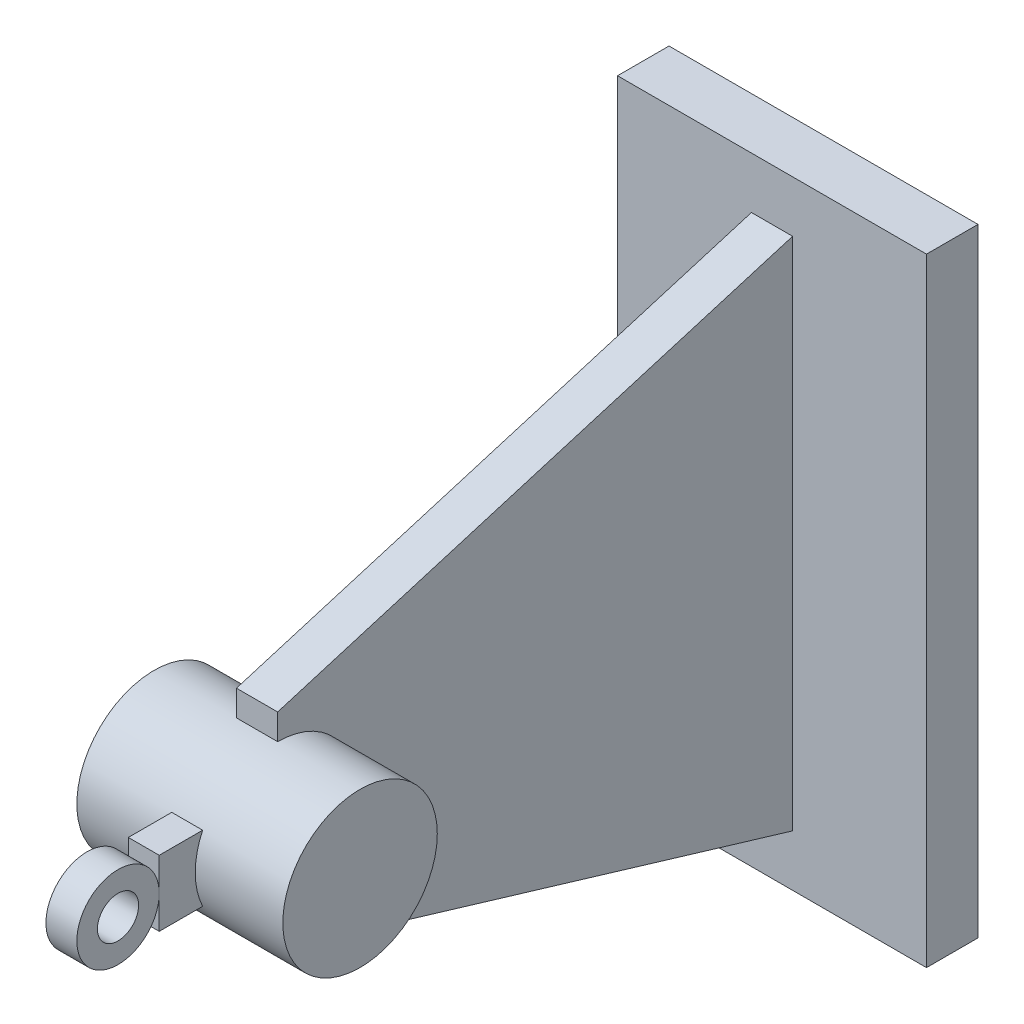
ISO-10303-21;
HEADER;
FILE_DESCRIPTION(('STEP AP214'),'2;1');
FILE_NAME('part.step','',(''),(''),'','','');
FILE_SCHEMA(('AUTOMOTIVE_DESIGN { 1 0 10303 214 1 1 1 1 }'));
ENDSEC;
DATA;
#1=APPLICATION_CONTEXT('core data for automotive mechanical design processes');
#2=APPLICATION_PROTOCOL_DEFINITION('international standard','automotive_design',2000,#1);
#3=PRODUCT_CONTEXT('',#1,'mechanical');
#4=PRODUCT('Part','Part','',(#3));
#5=PRODUCT_RELATED_PRODUCT_CATEGORY('part','',(#4));
#6=PRODUCT_DEFINITION_FORMATION('','',#4);
#7=PRODUCT_DEFINITION_CONTEXT('part definition',#1,'design');
#8=PRODUCT_DEFINITION('design','',#6,#7);
#9=PRODUCT_DEFINITION_SHAPE('','',#8);
#10=(LENGTH_UNIT() NAMED_UNIT(*) SI_UNIT(.MILLI.,.METRE.));
#11=(NAMED_UNIT(*) PLANE_ANGLE_UNIT() SI_UNIT($,.RADIAN.));
#12=(NAMED_UNIT(*) SI_UNIT($,.STERADIAN.) SOLID_ANGLE_UNIT());
#13=UNCERTAINTY_MEASURE_WITH_UNIT(LENGTH_MEASURE(1.E-05),#10,'distance_accuracy_value','');
#14=(GEOMETRIC_REPRESENTATION_CONTEXT(3) GLOBAL_UNCERTAINTY_ASSIGNED_CONTEXT((#13)) GLOBAL_UNIT_ASSIGNED_CONTEXT((#10,
#11,#12)) REPRESENTATION_CONTEXT('',''));
#15=CARTESIAN_POINT('',(0.,0.,0.));
#16=DIRECTION('',(0.,0.,1.));
#17=DIRECTION('',(1.,0.,0.));
#18=AXIS2_PLACEMENT_3D('',#15,#16,#17);
#19=CARTESIAN_POINT('',(-3.81,0.,165.1));
#20=DIRECTION('',(1.,0.,0.));
#21=DIRECTION('',(0.,0.,-1.));
#22=AXIS2_PLACEMENT_3D('',#19,#20,#21);
#23=CYLINDRICAL_SURFACE('',#22,10.16);
#24=CARTESIAN_POINT('',(-3.81,0.,165.1));
#25=DIRECTION('',(1.,0.,0.));
#26=DIRECTION('',(0.,0.,-1.));
#27=AXIS2_PLACEMENT_3D('',#24,#25,#26);
#28=CIRCLE('',#27,10.16);
#29=CARTESIAN_POINT('',(-3.81,0.,154.94));
#30=VERTEX_POINT('',#29);
#31=EDGE_CURVE('E11',#30,#30,#28,.T.);
#32=CARTESIAN_POINT('',(3.81,0.,165.1));
#33=DIRECTION('',(1.,0.,0.));
#34=DIRECTION('',(0.,0.,-1.));
#35=AXIS2_PLACEMENT_3D('',#32,#33,#34);
#36=CIRCLE('',#35,10.16);
#37=CARTESIAN_POINT('',(3.81,0.,154.94));
#38=VERTEX_POINT('',#37);
#39=EDGE_CURVE('E57',#38,#38,#36,.T.);
#40=CARTESIAN_POINT('',(-3.81,0.,154.94));
#41=CARTESIAN_POINT('',(-3.730625,0.,154.94));
#42=CARTESIAN_POINT('',(-3.65125,0.,154.94));
#43=CARTESIAN_POINT('',(-3.4925,0.,154.94));
#44=CARTESIAN_POINT('',(-3.413125,0.,154.94));
#45=CARTESIAN_POINT('',(-3.254375,0.,154.94));
#46=CARTESIAN_POINT('',(-3.175,0.,154.94));
#47=CARTESIAN_POINT('',(-3.01625,0.,154.94));
#48=CARTESIAN_POINT('',(-2.936875,0.,154.94));
#49=CARTESIAN_POINT('',(-2.778125,0.,154.94));
#50=CARTESIAN_POINT('',(-2.69875,0.,154.94));
#51=CARTESIAN_POINT('',(-2.54,0.,154.94));
#52=CARTESIAN_POINT('',(-2.460625,0.,154.94));
#53=CARTESIAN_POINT('',(-2.301875,0.,154.94));
#54=CARTESIAN_POINT('',(-2.2225,0.,154.94));
#55=CARTESIAN_POINT('',(-2.06375,0.,154.94));
#56=CARTESIAN_POINT('',(-1.984375,0.,154.94));
#57=CARTESIAN_POINT('',(-1.825625,0.,154.94));
#58=CARTESIAN_POINT('',(-1.74625,0.,154.94));
#59=CARTESIAN_POINT('',(-1.5875,0.,154.94));
#60=CARTESIAN_POINT('',(-1.508125,0.,154.94));
#61=CARTESIAN_POINT('',(-1.349375,0.,154.94));
#62=CARTESIAN_POINT('',(-1.27,0.,154.94));
#63=CARTESIAN_POINT('',(-1.11125,0.,154.94));
#64=CARTESIAN_POINT('',(-1.031875,0.,154.94));
#65=CARTESIAN_POINT('',(-0.873125,0.,154.94));
#66=CARTESIAN_POINT('',(-0.79375,0.,154.94));
#67=CARTESIAN_POINT('',(-0.635,0.,154.94));
#68=CARTESIAN_POINT('',(-0.555625,0.,154.94));
#69=CARTESIAN_POINT('',(-0.396875,0.,154.94));
#70=CARTESIAN_POINT('',(-0.3175,0.,154.94));
#71=CARTESIAN_POINT('',(-0.15875,0.,154.94));
#72=CARTESIAN_POINT('',(-0.079375,0.,154.94));
#73=CARTESIAN_POINT('',(0.0793749999999997,0.,154.94));
#74=CARTESIAN_POINT('',(0.158749999999999,0.,154.94));
#75=CARTESIAN_POINT('',(0.317499999999999,0.,154.94));
#76=CARTESIAN_POINT('',(0.396874999999999,0.,154.94));
#77=CARTESIAN_POINT('',(0.555625,0.,154.94));
#78=CARTESIAN_POINT('',(0.634999999999999,0.,154.94));
#79=CARTESIAN_POINT('',(0.79375,0.,154.94));
#80=CARTESIAN_POINT('',(0.873125,0.,154.94));
#81=CARTESIAN_POINT('',(1.031875,0.,154.94));
#82=CARTESIAN_POINT('',(1.11125,0.,154.94));
#83=CARTESIAN_POINT('',(1.27,0.,154.94));
#84=CARTESIAN_POINT('',(1.349375,0.,154.94));
#85=CARTESIAN_POINT('',(1.508125,0.,154.94));
#86=CARTESIAN_POINT('',(1.5875,0.,154.94));
#87=CARTESIAN_POINT('',(1.74625,0.,154.94));
#88=CARTESIAN_POINT('',(1.825625,0.,154.94));
#89=CARTESIAN_POINT('',(1.984375,0.,154.94));
#90=CARTESIAN_POINT('',(2.06375,0.,154.94));
#91=CARTESIAN_POINT('',(2.2225,0.,154.94));
#92=CARTESIAN_POINT('',(2.301875,0.,154.94));
#93=CARTESIAN_POINT('',(2.460625,0.,154.94));
#94=CARTESIAN_POINT('',(2.54,0.,154.94));
#95=CARTESIAN_POINT('',(2.69875,0.,154.94));
#96=CARTESIAN_POINT('',(2.778125,0.,154.94));
#97=CARTESIAN_POINT('',(2.936875,0.,154.94));
#98=CARTESIAN_POINT('',(3.01625,0.,154.94));
#99=CARTESIAN_POINT('',(3.175,0.,154.94));
#100=CARTESIAN_POINT('',(3.254375,0.,154.94));
#101=CARTESIAN_POINT('',(3.413125,0.,154.94));
#102=CARTESIAN_POINT('',(3.4925,0.,154.94));
#103=CARTESIAN_POINT('',(3.65125,0.,154.94));
#104=CARTESIAN_POINT('',(3.730625,0.,154.94));
#105=CARTESIAN_POINT('',(3.81,0.,154.94));
#106=B_SPLINE_CURVE_WITH_KNOTS('',3,(#40,#41,#42,#43,#44,#45,#46,#47,#48,#49,#50,#51,#52,#53,
#54,#55,#56,#57,#58,#59,#60,#61,#62,#63,#64,#65,#66,#67,#68,#69,#70,#71,#72,#73,#74,#75,#76,#77,
#78,#79,#80,#81,#82,#83,#84,#85,#86,#87,#88,#89,#90,#91,#92,#93,#94,#95,#96,#97,#98,#99,#100,
#101,#102,#103,#104,#105),.UNSPECIFIED.,.F.,.F.,(4,2,2,2,2,2,2,2,2,2,2,2,2,2,2,2,2,2,2,2,2,2,2,
2,2,2,2,2,2,2,2,2,4),(0.,0.238125,0.47625,0.714375,0.9525,1.190625,1.42875,1.666875,1.905,
2.143125,2.38125,2.619375,2.8575,3.095625,3.33375,3.571875,3.81,4.048125,4.28625,4.524375,
4.7625,5.000625,5.23875,5.476875,5.715,5.953125,6.19125,6.429375,6.6675,6.905625,7.14375,
7.381875,7.62),.UNSPECIFIED.);
#107=EDGE_CURVE('BSEAM47',#30,#38,#106,.T.);
#108=ORIENTED_EDGE('',*,*,#31,.T.);
#109=ORIENTED_EDGE('',*,*,#39,.F.);
#110=ORIENTED_EDGE('',*,*,#107,.T.);
#111=ORIENTED_EDGE('',*,*,#107,.F.);
#112=EDGE_LOOP('',(#108,#110,#109,#111));
#113=FACE_BOUND('',#112,.T.);
#114=ADVANCED_FACE('F47',(#113),#23,.T.);
#115=CARTESIAN_POINT('',(-3.81,0.,165.1));
#116=DIRECTION('',(1.,0.,0.));
#117=DIRECTION('',(0.,0.,-1.));
#118=AXIS2_PLACEMENT_3D('',#115,#116,#117);
#119=PLANE('',#118);
#120=CARTESIAN_POINT('',(-3.81,0.,165.1));
#121=DIRECTION('',(1.,0.,0.));
#122=DIRECTION('',(0.,0.,-1.));
#123=AXIS2_PLACEMENT_3D('',#120,#121,#122);
#124=CIRCLE('',#123,5.08);
#125=CARTESIAN_POINT('',(-3.81,0.,160.02));
#126=VERTEX_POINT('',#125);
#127=EDGE_CURVE('E53',#126,#126,#124,.T.);
#128=ORIENTED_EDGE('',*,*,#127,.T.);
#129=EDGE_LOOP('',(#128));
#130=FACE_BOUND('',#129,.T.);
#131=ORIENTED_EDGE('',*,*,#31,.F.);
#132=EDGE_LOOP('',(#131));
#133=FACE_BOUND('',#132,.T.);
#134=ADVANCED_FACE('F76',(#130,#133),#119,.F.);
#135=CARTESIAN_POINT('',(-3.81,0.,165.1));
#136=DIRECTION('',(1.,0.,0.));
#137=DIRECTION('',(0.,0.,-1.));
#138=AXIS2_PLACEMENT_3D('',#135,#136,#137);
#139=CYLINDRICAL_SURFACE('',#138,5.08);
#140=CARTESIAN_POINT('',(3.81,0.,165.1));
#141=DIRECTION('',(1.,0.,0.));
#142=DIRECTION('',(0.,0.,-1.));
#143=AXIS2_PLACEMENT_3D('',#140,#141,#142);
#144=CIRCLE('',#143,5.08);
#145=CARTESIAN_POINT('',(3.81,0.,160.02));
#146=VERTEX_POINT('',#145);
#147=EDGE_CURVE('E61',#146,#146,#144,.T.);
#148=CARTESIAN_POINT('',(-3.81,0.,160.02));
#149=CARTESIAN_POINT('',(-3.730625,0.,160.02));
#150=CARTESIAN_POINT('',(-3.65125,0.,160.02));
#151=CARTESIAN_POINT('',(-3.4925,0.,160.02));
#152=CARTESIAN_POINT('',(-3.413125,0.,160.02));
#153=CARTESIAN_POINT('',(-3.254375,0.,160.02));
#154=CARTESIAN_POINT('',(-3.175,0.,160.02));
#155=CARTESIAN_POINT('',(-3.01625,0.,160.02));
#156=CARTESIAN_POINT('',(-2.936875,0.,160.02));
#157=CARTESIAN_POINT('',(-2.778125,0.,160.02));
#158=CARTESIAN_POINT('',(-2.69875,0.,160.02));
#159=CARTESIAN_POINT('',(-2.54,0.,160.02));
#160=CARTESIAN_POINT('',(-2.460625,0.,160.02));
#161=CARTESIAN_POINT('',(-2.301875,0.,160.02));
#162=CARTESIAN_POINT('',(-2.2225,0.,160.02));
#163=CARTESIAN_POINT('',(-2.06375,0.,160.02));
#164=CARTESIAN_POINT('',(-1.984375,0.,160.02));
#165=CARTESIAN_POINT('',(-1.825625,0.,160.02));
#166=CARTESIAN_POINT('',(-1.74625,0.,160.02));
#167=CARTESIAN_POINT('',(-1.5875,0.,160.02));
#168=CARTESIAN_POINT('',(-1.508125,0.,160.02));
#169=CARTESIAN_POINT('',(-1.349375,0.,160.02));
#170=CARTESIAN_POINT('',(-1.27,0.,160.02));
#171=CARTESIAN_POINT('',(-1.11125,0.,160.02));
#172=CARTESIAN_POINT('',(-1.031875,0.,160.02));
#173=CARTESIAN_POINT('',(-0.873125000000001,0.,160.02));
#174=CARTESIAN_POINT('',(-0.793750000000001,0.,160.02));
#175=CARTESIAN_POINT('',(-0.635000000000001,0.,160.02));
#176=CARTESIAN_POINT('',(-0.555625000000001,0.,160.02));
#177=CARTESIAN_POINT('',(-0.396875000000001,0.,160.02));
#178=CARTESIAN_POINT('',(-0.317500000000001,0.,160.02));
#179=CARTESIAN_POINT('',(-0.15875,0.,160.02));
#180=CARTESIAN_POINT('',(-0.0793750000000004,0.,160.02));
#181=CARTESIAN_POINT('',(0.0793749999999994,0.,160.02));
#182=CARTESIAN_POINT('',(0.158749999999999,0.,160.02));
#183=CARTESIAN_POINT('',(0.317499999999999,0.,160.02));
#184=CARTESIAN_POINT('',(0.396874999999999,0.,160.02));
#185=CARTESIAN_POINT('',(0.555625,0.,160.02));
#186=CARTESIAN_POINT('',(0.634999999999999,0.,160.02));
#187=CARTESIAN_POINT('',(0.79375,0.,160.02));
#188=CARTESIAN_POINT('',(0.873125,0.,160.02));
#189=CARTESIAN_POINT('',(1.031875,0.,160.02));
#190=CARTESIAN_POINT('',(1.11125,0.,160.02));
#191=CARTESIAN_POINT('',(1.27,0.,160.02));
#192=CARTESIAN_POINT('',(1.349375,0.,160.02));
#193=CARTESIAN_POINT('',(1.508125,0.,160.02));
#194=CARTESIAN_POINT('',(1.5875,0.,160.02));
#195=CARTESIAN_POINT('',(1.74625,0.,160.02));
#196=CARTESIAN_POINT('',(1.825625,0.,160.02));
#197=CARTESIAN_POINT('',(1.984375,0.,160.02));
#198=CARTESIAN_POINT('',(2.06375,0.,160.02));
#199=CARTESIAN_POINT('',(2.2225,0.,160.02));
#200=CARTESIAN_POINT('',(2.301875,0.,160.02));
#201=CARTESIAN_POINT('',(2.460625,0.,160.02));
#202=CARTESIAN_POINT('',(2.54,0.,160.02));
#203=CARTESIAN_POINT('',(2.69875,0.,160.02));
#204=CARTESIAN_POINT('',(2.778125,0.,160.02));
#205=CARTESIAN_POINT('',(2.936875,0.,160.02));
#206=CARTESIAN_POINT('',(3.01625,0.,160.02));
#207=CARTESIAN_POINT('',(3.175,0.,160.02));
#208=CARTESIAN_POINT('',(3.254375,0.,160.02));
#209=CARTESIAN_POINT('',(3.413125,0.,160.02));
#210=CARTESIAN_POINT('',(3.4925,0.,160.02));
#211=CARTESIAN_POINT('',(3.65125,0.,160.02));
#212=CARTESIAN_POINT('',(3.730625,0.,160.02));
#213=CARTESIAN_POINT('',(3.81,0.,160.02));
#214=B_SPLINE_CURVE_WITH_KNOTS('',3,(#148,#149,#150,#151,#152,#153,#154,#155,#156,#157,#158,
#159,#160,#161,#162,#163,#164,#165,#166,#167,#168,#169,#170,#171,#172,#173,#174,#175,#176,#177,
#178,#179,#180,#181,#182,#183,#184,#185,#186,#187,#188,#189,#190,#191,#192,#193,#194,#195,#196,
#197,#198,#199,#200,#201,#202,#203,#204,#205,#206,#207,#208,#209,#210,#211,#212,#213),
.UNSPECIFIED.,.F.,.F.,(4,2,2,2,2,2,2,2,2,2,2,2,2,2,2,2,2,2,2,2,2,2,2,2,2,2,2,2,2,2,2,2,4),(0.,
0.238125,0.47625,0.714375,0.9525,1.190625,1.42875,1.666875,1.905,2.143125,2.38125,2.619375,
2.8575,3.095625,3.33375,3.571875,3.81,4.048125,4.28625,4.524375,4.7625,5.000625,5.23875,
5.476875,5.715,5.953125,6.19125,6.429375,6.6675,6.905625,7.14375,7.381875,7.62),.UNSPECIFIED.);
#215=EDGE_CURVE('BSEAM67',#126,#146,#214,.T.);
#216=ORIENTED_EDGE('',*,*,#127,.F.);
#217=ORIENTED_EDGE('',*,*,#147,.T.);
#218=ORIENTED_EDGE('',*,*,#215,.T.);
#219=ORIENTED_EDGE('',*,*,#215,.F.);
#220=EDGE_LOOP('',(#216,#218,#217,#219));
#221=FACE_BOUND('',#220,.T.);
#222=ADVANCED_FACE('F67',(#221),#139,.F.);
#223=CARTESIAN_POINT('',(3.81,0.,165.1));
#224=DIRECTION('',(1.,0.,0.));
#225=DIRECTION('',(0.,0.,-1.));
#226=AXIS2_PLACEMENT_3D('',#223,#224,#225);
#227=PLANE('',#226);
#228=ORIENTED_EDGE('',*,*,#39,.T.);
#229=EDGE_LOOP('',(#228));
#230=FACE_BOUND('',#229,.T.);
#231=ORIENTED_EDGE('',*,*,#147,.F.);
#232=EDGE_LOOP('',(#231));
#233=FACE_BOUND('',#232,.T.);
#234=ADVANCED_FACE('F69',(#230,#233),#227,.T.);
#235=CLOSED_SHELL('',(#114,#134,#222,#234));
#236=MANIFOLD_SOLID_BREP('B2',#235);
#237=CARTESIAN_POINT('',(-5.08,25.4,127.));
#238=DIRECTION('',(0.,0.,1.));
#239=DIRECTION('',(1.,0.,0.));
#240=AXIS2_PLACEMENT_3D('',#237,#238,#239);
#241=PLANE('',#240);
#242=DIRECTION('',(1.,0.,0.));
#243=VECTOR('',#242,1.);
#244=CARTESIAN_POINT('',(-25.4,-19.05,127.));
#245=LINE('',#244,#243);
#246=CARTESIAN_POINT('',(-5.08,-19.05,127.));
#247=VERTEX_POINT('',#246);
#248=CARTESIAN_POINT('',(5.08,-19.05,127.));
#249=VERTEX_POINT('',#248);
#250=EDGE_CURVE('E132',#247,#249,#245,.T.);
#251=ORIENTED_EDGE('',*,*,#250,.F.);
#252=DIRECTION('',(0.,-1.,0.));
#253=VECTOR('',#252,1.);
#254=CARTESIAN_POINT('',(-5.08,25.4,127.));
#255=LINE('',#254,#253);
#256=CARTESIAN_POINT('',(-5.08,-25.4,127.));
#257=VERTEX_POINT('',#256);
#258=EDGE_CURVE('E271',#247,#257,#255,.T.);
#259=ORIENTED_EDGE('',*,*,#258,.T.);
#260=DIRECTION('',(1.,0.,0.));
#261=VECTOR('',#260,1.);
#262=CARTESIAN_POINT('',(-5.08,-25.4,127.));
#263=LINE('',#262,#261);
#264=CARTESIAN_POINT('',(5.08,-25.4,127.));
#265=VERTEX_POINT('',#264);
#266=EDGE_CURVE('E276',#257,#265,#263,.T.);
#267=ORIENTED_EDGE('',*,*,#266,.T.);
#268=DIRECTION('',(0.,-1.,0.));
#269=VECTOR('',#268,1.);
#270=CARTESIAN_POINT('',(5.08,25.4,127.));
#271=LINE('',#270,#269);
#272=EDGE_CURVE('E259',#249,#265,#271,.T.);
#273=ORIENTED_EDGE('',*,*,#272,.F.);
#274=EDGE_LOOP('',(#251,#259,#267,#273));
#275=FACE_BOUND('',#274,.T.);
#276=ADVANCED_FACE('F109',(#275),#241,.T.);
#277=CARTESIAN_POINT('',(0.,0.,0.));
#278=DIRECTION('',(0.,0.,-1.));
#279=DIRECTION('',(-1.,0.,0.));
#280=AXIS2_PLACEMENT_3D('',#277,#278,#279);
#281=PLANE('',#280);
#282=DIRECTION('',(-1.,0.,0.));
#283=VECTOR('',#282,1.);
#284=CARTESIAN_POINT('',(38.1,76.2,0.));
#285=LINE('',#284,#283);
#286=CARTESIAN_POINT('',(38.1,76.2,0.));
#287=VERTEX_POINT('',#286);
#288=CARTESIAN_POINT('',(-38.1,76.2,0.));
#289=VERTEX_POINT('',#288);
#290=EDGE_CURVE('E279',#287,#289,#285,.T.);
#291=ORIENTED_EDGE('',*,*,#290,.T.);
#292=DIRECTION('',(0.,-1.,0.));
#293=VECTOR('',#292,1.);
#294=CARTESIAN_POINT('',(-38.1,-76.2,0.));
#295=LINE('',#294,#293);
#296=CARTESIAN_POINT('',(-38.1,-76.2,0.));
#297=VERTEX_POINT('',#296);
#298=EDGE_CURVE('E303',#289,#297,#295,.T.);
#299=ORIENTED_EDGE('',*,*,#298,.T.);
#300=DIRECTION('',(1.,0.,0.));
#301=VECTOR('',#300,1.);
#302=CARTESIAN_POINT('',(38.1,-76.2,0.));
#303=LINE('',#302,#301);
#304=CARTESIAN_POINT('',(38.1,-76.2,0.));
#305=VERTEX_POINT('',#304);
#306=EDGE_CURVE('E306',#297,#305,#303,.T.);
#307=ORIENTED_EDGE('',*,*,#306,.T.);
#308=DIRECTION('',(0.,1.,0.));
#309=VECTOR('',#308,1.);
#310=CARTESIAN_POINT('',(38.1,-76.2,0.));
#311=LINE('',#310,#309);
#312=EDGE_CURVE('E291',#305,#287,#311,.T.);
#313=ORIENTED_EDGE('',*,*,#312,.T.);
#314=EDGE_LOOP('',(#291,#299,#307,#313));
#315=FACE_BOUND('',#314,.T.);
#316=DIRECTION('',(0.,1.,0.));
#317=VECTOR('',#316,1.);
#318=CARTESIAN_POINT('',(-5.08,-63.5,0.));
#319=LINE('',#318,#317);
#320=CARTESIAN_POINT('',(-5.08,-63.5,0.));
#321=VERTEX_POINT('',#320);
#322=CARTESIAN_POINT('',(-5.08,63.5,0.));
#323=VERTEX_POINT('',#322);
#324=EDGE_CURVE('E265',#321,#323,#319,.T.);
#325=ORIENTED_EDGE('',*,*,#324,.T.);
#326=DIRECTION('',(1.,0.,0.));
#327=VECTOR('',#326,1.);
#328=CARTESIAN_POINT('',(-5.08,63.5,0.));
#329=LINE('',#328,#327);
#330=CARTESIAN_POINT('',(5.08,63.5,0.));
#331=VERTEX_POINT('',#330);
#332=EDGE_CURVE('E282',#323,#331,#329,.T.);
#333=ORIENTED_EDGE('',*,*,#332,.T.);
#334=DIRECTION('',(0.,1.,0.));
#335=VECTOR('',#334,1.);
#336=CARTESIAN_POINT('',(5.08,-63.5,0.));
#337=LINE('',#336,#335);
#338=CARTESIAN_POINT('',(5.08,-63.5,0.));
#339=VERTEX_POINT('',#338);
#340=EDGE_CURVE('E254',#339,#331,#337,.T.);
#341=ORIENTED_EDGE('',*,*,#340,.F.);
#342=DIRECTION('',(1.,0.,0.));
#343=VECTOR('',#342,1.);
#344=CARTESIAN_POINT('',(-5.08,-63.5,0.));
#345=LINE('',#344,#343);
#346=EDGE_CURVE('E275',#321,#339,#345,.T.);
#347=ORIENTED_EDGE('',*,*,#346,.F.);
#348=EDGE_LOOP('',(#325,#333,#341,#347));
#349=FACE_BOUND('',#348,.T.);
#350=ADVANCED_FACE('F344',(#315,#349),#281,.F.);
#351=CARTESIAN_POINT('',(38.1,76.2,-12.7));
#352=DIRECTION('',(0.,1.,0.));
#353=DIRECTION('',(0.,0.,1.));
#354=AXIS2_PLACEMENT_3D('',#351,#352,#353);
#355=PLANE('',#354);
#356=ORIENTED_EDGE('',*,*,#290,.F.);
#357=DIRECTION('',(0.,0.,1.));
#358=VECTOR('',#357,1.);
#359=CARTESIAN_POINT('',(38.1,76.2,-12.7));
#360=LINE('',#359,#358);
#361=CARTESIAN_POINT('',(38.1,76.2,-12.7));
#362=VERTEX_POINT('',#361);
#363=EDGE_CURVE('E311',#362,#287,#360,.T.);
#364=ORIENTED_EDGE('',*,*,#363,.F.);
#365=DIRECTION('',(-1.,0.,0.));
#366=VECTOR('',#365,1.);
#367=CARTESIAN_POINT('',(38.1,76.2,-12.7));
#368=LINE('',#367,#366);
#369=CARTESIAN_POINT('',(-38.1,76.2,-12.7));
#370=VERTEX_POINT('',#369);
#371=EDGE_CURVE('E287',#362,#370,#368,.T.);
#372=ORIENTED_EDGE('',*,*,#371,.T.);
#373=DIRECTION('',(0.,0.,1.));
#374=VECTOR('',#373,1.);
#375=CARTESIAN_POINT('',(-38.1,76.2,-12.7));
#376=LINE('',#375,#374);
#377=EDGE_CURVE('E300',#370,#289,#376,.T.);
#378=ORIENTED_EDGE('',*,*,#377,.T.);
#379=EDGE_LOOP('',(#356,#364,#372,#378));
#380=FACE_BOUND('',#379,.T.);
#381=ADVANCED_FACE('F111',(#380),#355,.T.);
#382=CARTESIAN_POINT('',(38.1,-76.2,-12.7));
#383=DIRECTION('',(1.,0.,0.));
#384=DIRECTION('',(0.,0.,-1.));
#385=AXIS2_PLACEMENT_3D('',#382,#383,#384);
#386=PLANE('',#385);
#387=ORIENTED_EDGE('',*,*,#312,.F.);
#388=DIRECTION('',(0.,0.,1.));
#389=VECTOR('',#388,1.);
#390=CARTESIAN_POINT('',(38.1,-76.2,-12.7));
#391=LINE('',#390,#389);
#392=CARTESIAN_POINT('',(38.1,-76.2,-12.7));
#393=VERTEX_POINT('',#392);
#394=EDGE_CURVE('E314',#393,#305,#391,.T.);
#395=ORIENTED_EDGE('',*,*,#394,.F.);
#396=DIRECTION('',(0.,1.,0.));
#397=VECTOR('',#396,1.);
#398=CARTESIAN_POINT('',(38.1,-76.2,-12.7));
#399=LINE('',#398,#397);
#400=EDGE_CURVE('E297',#393,#362,#399,.T.);
#401=ORIENTED_EDGE('',*,*,#400,.T.);
#402=ORIENTED_EDGE('',*,*,#363,.T.);
#403=EDGE_LOOP('',(#387,#395,#401,#402));
#404=FACE_BOUND('',#403,.T.);
#405=ADVANCED_FACE('F504',(#404),#386,.T.);
#406=CARTESIAN_POINT('',(38.1,-76.2,-12.7));
#407=DIRECTION('',(0.,-1.,0.));
#408=DIRECTION('',(0.,0.,-1.));
#409=AXIS2_PLACEMENT_3D('',#406,#407,#408);
#410=PLANE('',#409);
#411=ORIENTED_EDGE('',*,*,#306,.F.);
#412=DIRECTION('',(0.,0.,1.));
#413=VECTOR('',#412,1.);
#414=CARTESIAN_POINT('',(-38.1,-76.2,-12.7));
#415=LINE('',#414,#413);
#416=CARTESIAN_POINT('',(-38.1,-76.2,-12.7));
#417=VERTEX_POINT('',#416);
#418=EDGE_CURVE('E316',#417,#297,#415,.T.);
#419=ORIENTED_EDGE('',*,*,#418,.F.);
#420=DIRECTION('',(1.,0.,0.));
#421=VECTOR('',#420,1.);
#422=CARTESIAN_POINT('',(38.1,-76.2,-12.7));
#423=LINE('',#422,#421);
#424=EDGE_CURVE('E294',#417,#393,#423,.T.);
#425=ORIENTED_EDGE('',*,*,#424,.T.);
#426=ORIENTED_EDGE('',*,*,#394,.T.);
#427=EDGE_LOOP('',(#411,#419,#425,#426));
#428=FACE_BOUND('',#427,.T.);
#429=ADVANCED_FACE('F496',(#428),#410,.T.);
#430=CARTESIAN_POINT('',(-38.1,-76.2,-12.7));
#431=DIRECTION('',(-1.,0.,0.));
#432=DIRECTION('',(0.,0.,1.));
#433=AXIS2_PLACEMENT_3D('',#430,#431,#432);
#434=PLANE('',#433);
#435=ORIENTED_EDGE('',*,*,#298,.F.);
#436=ORIENTED_EDGE('',*,*,#377,.F.);
#437=DIRECTION('',(0.,-1.,0.));
#438=VECTOR('',#437,1.);
#439=CARTESIAN_POINT('',(-38.1,-76.2,-12.7));
#440=LINE('',#439,#438);
#441=EDGE_CURVE('E290',#370,#417,#440,.T.);
#442=ORIENTED_EDGE('',*,*,#441,.T.);
#443=ORIENTED_EDGE('',*,*,#418,.T.);
#444=EDGE_LOOP('',(#435,#436,#442,#443));
#445=FACE_BOUND('',#444,.T.);
#446=ADVANCED_FACE('F487',(#445),#434,.T.);
#447=CARTESIAN_POINT('',(0.,0.,-12.7));
#448=DIRECTION('',(0.,0.,-1.));
#449=DIRECTION('',(-1.,0.,0.));
#450=AXIS2_PLACEMENT_3D('',#447,#448,#449);
#451=PLANE('',#450);
#452=ORIENTED_EDGE('',*,*,#371,.F.);
#453=ORIENTED_EDGE('',*,*,#400,.F.);
#454=ORIENTED_EDGE('',*,*,#424,.F.);
#455=ORIENTED_EDGE('',*,*,#441,.F.);
#456=EDGE_LOOP('',(#452,#453,#454,#455));
#457=FACE_BOUND('',#456,.T.);
#458=ADVANCED_FACE('F365',(#457),#451,.T.);
#459=CARTESIAN_POINT('',(-5.08,-25.4,127.));
#460=DIRECTION('',(0.,-0.957826285221151,0.287347885566345));
#461=DIRECTION('',(0.,-0.287347885566345,-0.957826285221152));
#462=AXIS2_PLACEMENT_3D('',#459,#460,#461);
#463=PLANE('',#462);
#464=ORIENTED_EDGE('',*,*,#346,.T.);
#465=DIRECTION('',(0.,-0.287347885566345,-0.957826285221151));
#466=VECTOR('',#465,1.);
#467=CARTESIAN_POINT('',(5.08,-25.4,127.));
#468=LINE('',#467,#466);
#469=EDGE_CURVE('E252',#265,#339,#468,.T.);
#470=ORIENTED_EDGE('',*,*,#469,.F.);
#471=ORIENTED_EDGE('',*,*,#266,.F.);
#472=DIRECTION('',(0.,-0.287347885566345,-0.957826285221151));
#473=VECTOR('',#472,1.);
#474=CARTESIAN_POINT('',(-5.08,-25.4,127.));
#475=LINE('',#474,#473);
#476=EDGE_CURVE('E262',#257,#321,#475,.T.);
#477=ORIENTED_EDGE('',*,*,#476,.T.);
#478=EDGE_LOOP('',(#464,#470,#471,#477));
#479=FACE_BOUND('',#478,.T.);
#480=ADVANCED_FACE('F357',(#479),#463,.T.);
#481=DIRECTION('',(1.,0.,0.));
#482=VECTOR('',#481,1.);
#483=CARTESIAN_POINT('',(-25.4,19.05,127.));
#484=LINE('',#483,#482);
#485=CARTESIAN_POINT('',(5.08,19.05,127.));
#486=VERTEX_POINT('',#485);
#487=CARTESIAN_POINT('',(-5.08,19.05,127.));
#488=VERTEX_POINT('',#487);
#489=EDGE_CURVE('E246',#486,#488,#484,.F.);
#490=ORIENTED_EDGE('',*,*,#489,.F.);
#491=CARTESIAN_POINT('',(5.08,25.4,127.));
#492=VERTEX_POINT('',#491);
#493=EDGE_CURVE('E260',#492,#486,#271,.T.);
#494=ORIENTED_EDGE('',*,*,#493,.F.);
#495=DIRECTION('',(1.,0.,0.));
#496=VECTOR('',#495,1.);
#497=CARTESIAN_POINT('',(-5.08,25.4,127.));
#498=LINE('',#497,#496);
#499=CARTESIAN_POINT('',(-5.08,25.4,127.));
#500=VERTEX_POINT('',#499);
#501=EDGE_CURVE('E280',#500,#492,#498,.T.);
#502=ORIENTED_EDGE('',*,*,#501,.F.);
#503=EDGE_CURVE('E272',#500,#488,#255,.T.);
#504=ORIENTED_EDGE('',*,*,#503,.T.);
#505=EDGE_LOOP('',(#490,#494,#502,#504));
#506=FACE_BOUND('',#505,.T.);
#507=ADVANCED_FACE('F346',(#506),#241,.T.);
#508=CARTESIAN_POINT('',(-5.08,63.5,0.));
#509=DIRECTION('',(0.,0.957826285221151,0.287347885566345));
#510=DIRECTION('',(0.,-0.287347885566345,0.957826285221152));
#511=AXIS2_PLACEMENT_3D('',#508,#509,#510);
#512=PLANE('',#511);
#513=ORIENTED_EDGE('',*,*,#501,.T.);
#514=DIRECTION('',(0.,-0.287347885566345,0.957826285221151));
#515=VECTOR('',#514,1.);
#516=CARTESIAN_POINT('',(5.08,63.5,0.));
#517=LINE('',#516,#515);
#518=EDGE_CURVE('E256',#331,#492,#517,.T.);
#519=ORIENTED_EDGE('',*,*,#518,.F.);
#520=ORIENTED_EDGE('',*,*,#332,.F.);
#521=DIRECTION('',(0.,-0.287347885566345,0.957826285221151));
#522=VECTOR('',#521,1.);
#523=CARTESIAN_POINT('',(-5.08,63.5,0.));
#524=LINE('',#523,#522);
#525=EDGE_CURVE('E268',#323,#500,#524,.T.);
#526=ORIENTED_EDGE('',*,*,#525,.T.);
#527=EDGE_LOOP('',(#513,#519,#520,#526));
#528=FACE_BOUND('',#527,.T.);
#529=ADVANCED_FACE('F356',(#528),#512,.T.);
#530=CARTESIAN_POINT('',(-5.08,0.,0.));
#531=DIRECTION('',(1.,0.,0.));
#532=DIRECTION('',(0.,0.,-1.));
#533=AXIS2_PLACEMENT_3D('',#530,#531,#532);
#534=PLANE('',#533);
#535=ORIENTED_EDGE('',*,*,#258,.F.);
#536=CARTESIAN_POINT('',(-5.08,0.,127.));
#537=DIRECTION('',(1.,0.,0.));
#538=DIRECTION('',(0.,0.,-1.));
#539=AXIS2_PLACEMENT_3D('',#536,#537,#538);
#540=CIRCLE('',#539,19.05);
#541=EDGE_CURVE('E250',#247,#488,#540,.T.);
#542=ORIENTED_EDGE('',*,*,#541,.T.);
#543=ORIENTED_EDGE('',*,*,#503,.F.);
#544=ORIENTED_EDGE('',*,*,#525,.F.);
#545=ORIENTED_EDGE('',*,*,#324,.F.);
#546=ORIENTED_EDGE('',*,*,#476,.F.);
#547=EDGE_LOOP('',(#535,#542,#543,#544,#545,#546));
#548=FACE_BOUND('',#547,.T.);
#549=ADVANCED_FACE('F362',(#548),#534,.F.);
#550=CARTESIAN_POINT('',(5.08,0.,0.));
#551=DIRECTION('',(1.,0.,0.));
#552=DIRECTION('',(0.,0.,-1.));
#553=AXIS2_PLACEMENT_3D('',#550,#551,#552);
#554=PLANE('',#553);
#555=CARTESIAN_POINT('',(5.08,0.,127.));
#556=DIRECTION('',(1.,0.,0.));
#557=DIRECTION('',(0.,0.,-1.));
#558=AXIS2_PLACEMENT_3D('',#555,#556,#557);
#559=CIRCLE('',#558,19.05);
#560=EDGE_CURVE('E313',#249,#486,#559,.T.);
#561=ORIENTED_EDGE('',*,*,#560,.F.);
#562=ORIENTED_EDGE('',*,*,#272,.T.);
#563=ORIENTED_EDGE('',*,*,#469,.T.);
#564=ORIENTED_EDGE('',*,*,#340,.T.);
#565=ORIENTED_EDGE('',*,*,#518,.T.);
#566=ORIENTED_EDGE('',*,*,#493,.T.);
#567=EDGE_LOOP('',(#561,#562,#563,#564,#565,#566));
#568=FACE_BOUND('',#567,.T.);
#569=ADVANCED_FACE('F374',(#568),#554,.T.);
#570=CARTESIAN_POINT('',(-25.4,0.,127.));
#571=DIRECTION('',(1.,0.,0.));
#572=DIRECTION('',(0.,0.,-1.));
#573=AXIS2_PLACEMENT_3D('',#570,#571,#572);
#574=CYLINDRICAL_SURFACE('',#573,19.05);
#575=CARTESIAN_POINT('',(-3.81,0.,127.));
#576=DIRECTION('',(-1.,0.,0.));
#577=DIRECTION('',(0.,0.,1.));
#578=AXIS2_PLACEMENT_3D('',#575,#576,#577);
#579=CIRCLE('',#578,19.05);
#580=CARTESIAN_POINT('',(-3.81,8.128,144.228990568225));
#581=VERTEX_POINT('',#580);
#582=CARTESIAN_POINT('',(-3.81,-8.128,144.228990568225));
#583=VERTEX_POINT('',#582);
#584=EDGE_CURVE('E45',#581,#583,#579,.F.);
#585=ORIENTED_EDGE('',*,*,#584,.F.);
#586=DIRECTION('',(1.,0.,0.));
#587=VECTOR('',#586,1.);
#588=CARTESIAN_POINT('',(-25.4,8.128,144.228990568225));
#589=LINE('',#588,#587);
#590=CARTESIAN_POINT('',(3.81,8.128,144.228990568225));
#591=VERTEX_POINT('',#590);
#592=EDGE_CURVE('E117',#591,#581,#589,.F.);
#593=ORIENTED_EDGE('',*,*,#592,.F.);
#594=CARTESIAN_POINT('',(3.81,0.,127.));
#595=DIRECTION('',(-1.,0.,0.));
#596=DIRECTION('',(0.,0.,1.));
#597=AXIS2_PLACEMENT_3D('',#594,#595,#596);
#598=CIRCLE('',#597,19.05);
#599=CARTESIAN_POINT('',(3.81,-8.128,144.228990568225));
#600=VERTEX_POINT('',#599);
#601=EDGE_CURVE('E215',#591,#600,#598,.F.);
#602=ORIENTED_EDGE('',*,*,#601,.T.);
#603=DIRECTION('',(1.,0.,0.));
#604=VECTOR('',#603,1.);
#605=CARTESIAN_POINT('',(-25.4,-8.128,144.228990568225));
#606=LINE('',#605,#604);
#607=EDGE_CURVE('E322',#583,#600,#606,.T.);
#608=ORIENTED_EDGE('',*,*,#607,.F.);
#609=EDGE_LOOP('',(#585,#593,#602,#608));
#610=FACE_BOUND('',#609,.T.);
#611=CARTESIAN_POINT('',(25.4,0.,127.));
#612=DIRECTION('',(1.,0.,0.));
#613=DIRECTION('',(0.,0.,-1.));
#614=AXIS2_PLACEMENT_3D('',#611,#612,#613);
#615=CIRCLE('',#614,19.05);
#616=CARTESIAN_POINT('',(25.4,0.,107.95));
#617=VERTEX_POINT('',#616);
#618=EDGE_CURVE('E239',#617,#617,#615,.T.);
#619=ORIENTED_EDGE('',*,*,#618,.F.);
#620=EDGE_LOOP('',(#619));
#621=FACE_BOUND('',#620,.T.);
#622=CARTESIAN_POINT('',(-25.4,0.,127.));
#623=DIRECTION('',(1.,0.,0.));
#624=DIRECTION('',(0.,0.,-1.));
#625=AXIS2_PLACEMENT_3D('',#622,#623,#624);
#626=CIRCLE('',#625,19.05);
#627=CARTESIAN_POINT('',(-25.4,0.,107.95));
#628=VERTEX_POINT('',#627);
#629=EDGE_CURVE('E243',#628,#628,#626,.T.);
#630=ORIENTED_EDGE('',*,*,#629,.T.);
#631=EDGE_LOOP('',(#630));
#632=FACE_BOUND('',#631,.T.);
#633=ORIENTED_EDGE('',*,*,#541,.F.);
#634=ORIENTED_EDGE('',*,*,#250,.T.);
#635=ORIENTED_EDGE('',*,*,#560,.T.);
#636=ORIENTED_EDGE('',*,*,#489,.T.);
#637=EDGE_LOOP('',(#633,#634,#635,#636));
#638=FACE_BOUND('',#637,.T.);
#639=ADVANCED_FACE('F329',(#610,#621,#632,#638),#574,.T.);
#640=CARTESIAN_POINT('',(-25.4,0.,127.));
#641=DIRECTION('',(1.,0.,0.));
#642=DIRECTION('',(0.,0.,-1.));
#643=AXIS2_PLACEMENT_3D('',#640,#641,#642);
#644=PLANE('',#643);
#645=ORIENTED_EDGE('',*,*,#629,.F.);
#646=EDGE_LOOP('',(#645));
#647=FACE_BOUND('',#646,.T.);
#648=ADVANCED_FACE('F391',(#647),#644,.F.);
#649=CARTESIAN_POINT('',(25.4,0.,127.));
#650=DIRECTION('',(1.,0.,0.));
#651=DIRECTION('',(0.,0.,-1.));
#652=AXIS2_PLACEMENT_3D('',#649,#650,#651);
#653=PLANE('',#652);
#654=ORIENTED_EDGE('',*,*,#618,.T.);
#655=EDGE_LOOP('',(#654));
#656=FACE_BOUND('',#655,.T.);
#657=ADVANCED_FACE('F340',(#656),#653,.T.);
#658=CARTESIAN_POINT('',(-3.81,8.128,137.16));
#659=DIRECTION('',(0.,1.,0.));
#660=DIRECTION('',(0.,0.,1.));
#661=AXIS2_PLACEMENT_3D('',#658,#659,#660);
#662=PLANE('',#661);
#663=DIRECTION('',(0.,0.,1.));
#664=VECTOR('',#663,1.);
#665=CARTESIAN_POINT('',(3.81,8.128,137.16));
#666=LINE('',#665,#664);
#667=CARTESIAN_POINT('',(3.81,8.128,154.94));
#668=VERTEX_POINT('',#667);
#669=EDGE_CURVE('E209',#591,#668,#666,.T.);
#670=ORIENTED_EDGE('',*,*,#669,.F.);
#671=ORIENTED_EDGE('',*,*,#592,.T.);
#672=DIRECTION('',(0.,0.,1.));
#673=VECTOR('',#672,1.);
#674=CARTESIAN_POINT('',(-3.81,8.128,137.16));
#675=LINE('',#674,#673);
#676=CARTESIAN_POINT('',(-3.81,8.128,154.94));
#677=VERTEX_POINT('',#676);
#678=EDGE_CURVE('E223',#581,#677,#675,.T.);
#679=ORIENTED_EDGE('',*,*,#678,.T.);
#680=DIRECTION('',(1.,0.,0.));
#681=VECTOR('',#680,1.);
#682=CARTESIAN_POINT('',(-3.81,8.128,154.94));
#683=LINE('',#682,#681);
#684=EDGE_CURVE('E220',#677,#668,#683,.T.);
#685=ORIENTED_EDGE('',*,*,#684,.T.);
#686=EDGE_LOOP('',(#670,#671,#679,#685));
#687=FACE_BOUND('',#686,.T.);
#688=ADVANCED_FACE('F221',(#687),#662,.T.);
#689=CARTESIAN_POINT('',(-3.81,-8.128,137.16));
#690=DIRECTION('',(0.,-1.,0.));
#691=DIRECTION('',(0.,0.,-1.));
#692=AXIS2_PLACEMENT_3D('',#689,#690,#691);
#693=PLANE('',#692);
#694=DIRECTION('',(0.,0.,-1.));
#695=VECTOR('',#694,1.);
#696=CARTESIAN_POINT('',(-3.81,-8.128,137.16));
#697=LINE('',#696,#695);
#698=CARTESIAN_POINT('',(-3.81,-8.128,154.94));
#699=VERTEX_POINT('',#698);
#700=EDGE_CURVE('E228',#699,#583,#697,.T.);
#701=ORIENTED_EDGE('',*,*,#700,.T.);
#702=ORIENTED_EDGE('',*,*,#607,.T.);
#703=DIRECTION('',(0.,0.,-1.));
#704=VECTOR('',#703,1.);
#705=CARTESIAN_POINT('',(3.81,-8.128,137.16));
#706=LINE('',#705,#704);
#707=CARTESIAN_POINT('',(3.81,-8.128,154.94));
#708=VERTEX_POINT('',#707);
#709=EDGE_CURVE('E124',#708,#600,#706,.T.);
#710=ORIENTED_EDGE('',*,*,#709,.F.);
#711=DIRECTION('',(1.,0.,0.));
#712=VECTOR('',#711,1.);
#713=CARTESIAN_POINT('',(-3.81,-8.128,154.94));
#714=LINE('',#713,#712);
#715=EDGE_CURVE('E227',#699,#708,#714,.T.);
#716=ORIENTED_EDGE('',*,*,#715,.F.);
#717=EDGE_LOOP('',(#701,#702,#710,#716));
#718=FACE_BOUND('',#717,.T.);
#719=ADVANCED_FACE('F332',(#718),#693,.T.);
#720=CARTESIAN_POINT('',(-3.81,-8.128,154.94));
#721=DIRECTION('',(0.,0.,1.));
#722=DIRECTION('',(1.,0.,0.));
#723=AXIS2_PLACEMENT_3D('',#720,#721,#722);
#724=PLANE('',#723);
#725=ORIENTED_EDGE('',*,*,#715,.T.);
#726=DIRECTION('',(0.,-1.,0.));
#727=VECTOR('',#726,1.);
#728=CARTESIAN_POINT('',(3.81,-8.128,154.94));
#729=LINE('',#728,#727);
#730=EDGE_CURVE('E213',#668,#708,#729,.T.);
#731=ORIENTED_EDGE('',*,*,#730,.F.);
#732=ORIENTED_EDGE('',*,*,#684,.F.);
#733=DIRECTION('',(0.,-1.,0.));
#734=VECTOR('',#733,1.);
#735=CARTESIAN_POINT('',(-3.81,-8.128,154.94));
#736=LINE('',#735,#734);
#737=EDGE_CURVE('E235',#677,#699,#736,.T.);
#738=ORIENTED_EDGE('',*,*,#737,.T.);
#739=EDGE_LOOP('',(#725,#731,#732,#738));
#740=FACE_BOUND('',#739,.T.);
#741=ADVANCED_FACE('F230',(#740),#724,.T.);
#742=CARTESIAN_POINT('',(-3.81,0.,0.));
#743=DIRECTION('',(-1.,0.,0.));
#744=DIRECTION('',(0.,0.,1.));
#745=AXIS2_PLACEMENT_3D('',#742,#743,#744);
#746=PLANE('',#745);
#747=ORIENTED_EDGE('',*,*,#678,.F.);
#748=ORIENTED_EDGE('',*,*,#584,.T.);
#749=ORIENTED_EDGE('',*,*,#700,.F.);
#750=ORIENTED_EDGE('',*,*,#737,.F.);
#751=EDGE_LOOP('',(#747,#748,#749,#750));
#752=FACE_BOUND('',#751,.T.);
#753=ADVANCED_FACE('F326',(#752),#746,.T.);
#754=CARTESIAN_POINT('',(3.81,0.,0.));
#755=DIRECTION('',(-1.,0.,0.));
#756=DIRECTION('',(0.,0.,1.));
#757=AXIS2_PLACEMENT_3D('',#754,#755,#756);
#758=PLANE('',#757);
#759=ORIENTED_EDGE('',*,*,#601,.F.);
#760=ORIENTED_EDGE('',*,*,#669,.T.);
#761=ORIENTED_EDGE('',*,*,#730,.T.);
#762=ORIENTED_EDGE('',*,*,#709,.T.);
#763=EDGE_LOOP('',(#759,#760,#761,#762));
#764=FACE_BOUND('',#763,.T.);
#765=ADVANCED_FACE('F211',(#764),#758,.F.);
#766=CLOSED_SHELL('',(#276,#350,#381,#405,#429,#446,#458,#480,#507,#529,#549,#569,#639,#648,
#657,#688,#719,#741,#753,#765));
#767=MANIFOLD_SOLID_BREP('B6',#766);
#768=ADVANCED_BREP_SHAPE_REPRESENTATION('',(#18,#236,#767),#14);
#769=SHAPE_DEFINITION_REPRESENTATION(#9,#768);
ENDSEC;
END-ISO-10303-21;
